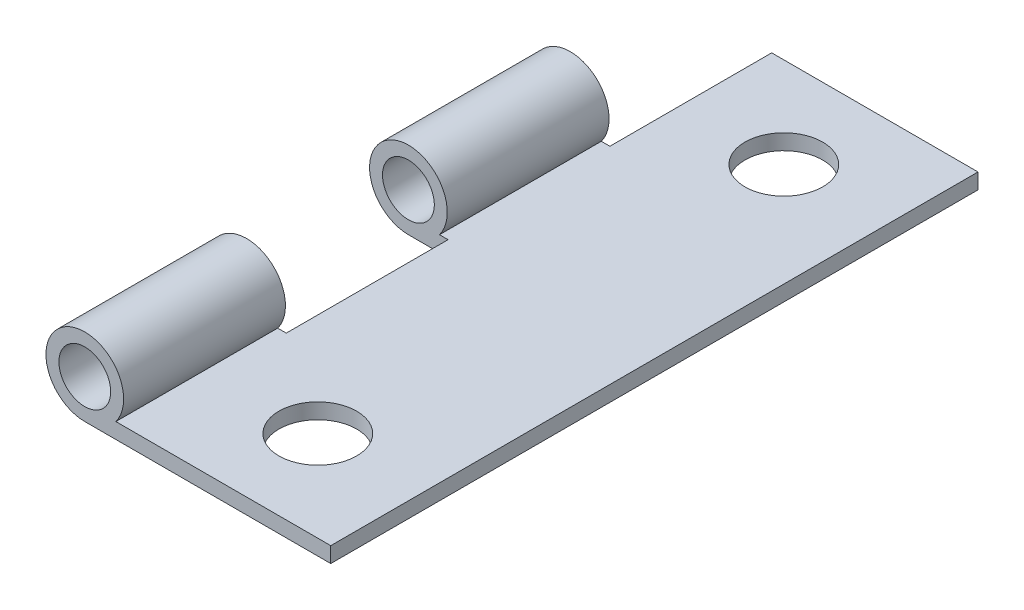
ISO-10303-21;
HEADER;
FILE_DESCRIPTION(('STEP AP214'),'2;1');
FILE_NAME('part.step','',(''),(''),'','','');
FILE_SCHEMA(('AUTOMOTIVE_DESIGN { 1 0 10303 214 1 1 1 1 }'));
ENDSEC;
DATA;
#1=APPLICATION_CONTEXT('core data for automotive mechanical design processes');
#2=APPLICATION_PROTOCOL_DEFINITION('international standard','automotive_design',2000,#1);
#3=PRODUCT_CONTEXT('',#1,'mechanical');
#4=PRODUCT('Part','Part','',(#3));
#5=PRODUCT_RELATED_PRODUCT_CATEGORY('part','',(#4));
#6=PRODUCT_DEFINITION_FORMATION('','',#4);
#7=PRODUCT_DEFINITION_CONTEXT('part definition',#1,'design');
#8=PRODUCT_DEFINITION('design','',#6,#7);
#9=PRODUCT_DEFINITION_SHAPE('','',#8);
#10=(LENGTH_UNIT() NAMED_UNIT(*) SI_UNIT(.MILLI.,.METRE.));
#11=(NAMED_UNIT(*) PLANE_ANGLE_UNIT() SI_UNIT($,.RADIAN.));
#12=(NAMED_UNIT(*) SI_UNIT($,.STERADIAN.) SOLID_ANGLE_UNIT());
#13=UNCERTAINTY_MEASURE_WITH_UNIT(LENGTH_MEASURE(1.E-05),#10,'distance_accuracy_value','');
#14=(GEOMETRIC_REPRESENTATION_CONTEXT(3) GLOBAL_UNCERTAINTY_ASSIGNED_CONTEXT((#13)) GLOBAL_UNIT_ASSIGNED_CONTEXT((#10,
#11,#12)) REPRESENTATION_CONTEXT('',''));
#15=CARTESIAN_POINT('',(0.,0.,0.));
#16=DIRECTION('',(0.,0.,1.));
#17=DIRECTION('',(1.,0.,0.));
#18=AXIS2_PLACEMENT_3D('',#15,#16,#17);
#19=CARTESIAN_POINT('',(0.,0.,12.5));
#20=DIRECTION('',(0.,0.,-1.));
#21=DIRECTION('',(-1.,0.,0.));
#22=AXIS2_PLACEMENT_3D('',#19,#20,#21);
#23=CYLINDRICAL_SURFACE('',#22,1.5);
#24=DIRECTION('',(0.,0.,-1.));
#25=VECTOR('',#24,1.);
#26=CARTESIAN_POINT('',(1.2,-0.900000000000001,12.5));
#27=LINE('',#26,#25);
#28=CARTESIAN_POINT('',(1.2,-0.900000000000001,0.));
#29=VERTEX_POINT('',#28);
#30=CARTESIAN_POINT('',(1.2,-0.900000000000001,-6.25));
#31=VERTEX_POINT('',#30);
#32=EDGE_CURVE('E170',#29,#31,#27,.T.);
#33=ORIENTED_EDGE('',*,*,#32,.T.);
#34=CARTESIAN_POINT('',(0.,0.,-6.25));
#35=DIRECTION('',(0.,0.,1.));
#36=DIRECTION('',(1.,0.,0.));
#37=AXIS2_PLACEMENT_3D('',#34,#35,#36);
#38=CIRCLE('',#37,1.5);
#39=CARTESIAN_POINT('',(0.,-1.5,-6.25));
#40=VERTEX_POINT('',#39);
#41=EDGE_CURVE('E48',#31,#40,#38,.T.);
#42=ORIENTED_EDGE('',*,*,#41,.T.);
#43=DIRECTION('',(0.,0.,-1.));
#44=VECTOR('',#43,1.);
#45=CARTESIAN_POINT('',(0.,-1.5,12.5));
#46=LINE('',#45,#44);
#47=CARTESIAN_POINT('',(0.,-1.5,0.));
#48=VERTEX_POINT('',#47);
#49=EDGE_CURVE('E185',#48,#40,#46,.T.);
#50=ORIENTED_EDGE('',*,*,#49,.F.);
#51=CARTESIAN_POINT('',(0.,0.,0.));
#52=DIRECTION('',(0.,0.,-1.));
#53=DIRECTION('',(-1.,0.,0.));
#54=AXIS2_PLACEMENT_3D('',#51,#52,#53);
#55=CIRCLE('',#54,1.5);
#56=EDGE_CURVE('E144',#48,#29,#55,.T.);
#57=ORIENTED_EDGE('',*,*,#56,.T.);
#58=EDGE_LOOP('',(#33,#42,#50,#57));
#59=FACE_BOUND('',#58,.T.);
#60=ADVANCED_FACE('F33',(#59),#23,.T.);
#61=CARTESIAN_POINT('',(0.,0.,12.5));
#62=DIRECTION('',(0.,0.,1.));
#63=DIRECTION('',(1.,0.,0.));
#64=AXIS2_PLACEMENT_3D('',#61,#62,#63);
#65=PLANE('',#64);
#66=CARTESIAN_POINT('',(0.,0.,12.5));
#67=DIRECTION('',(0.,0.,1.));
#68=DIRECTION('',(1.,0.,0.));
#69=AXIS2_PLACEMENT_3D('',#66,#67,#68);
#70=CIRCLE('',#69,1.5);
#71=CARTESIAN_POINT('',(1.2,-0.900000000000001,12.5));
#72=VERTEX_POINT('',#71);
#73=CARTESIAN_POINT('',(0.,-1.5,12.5));
#74=VERTEX_POINT('',#73);
#75=EDGE_CURVE('E160',#72,#74,#70,.T.);
#76=ORIENTED_EDGE('',*,*,#75,.T.);
#77=DIRECTION('',(1.,0.,0.));
#78=VECTOR('',#77,1.);
#79=CARTESIAN_POINT('',(0.,-1.5,12.5));
#80=LINE('',#79,#78);
#81=CARTESIAN_POINT('',(9.5,-1.5,12.5));
#82=VERTEX_POINT('',#81);
#83=EDGE_CURVE('E163',#74,#82,#80,.T.);
#84=ORIENTED_EDGE('',*,*,#83,.T.);
#85=DIRECTION('',(0.,1.,0.));
#86=VECTOR('',#85,1.);
#87=CARTESIAN_POINT('',(9.5,-1.5,12.5));
#88=LINE('',#87,#86);
#89=CARTESIAN_POINT('',(9.5,-0.9,12.5));
#90=VERTEX_POINT('',#89);
#91=EDGE_CURVE('E166',#82,#90,#88,.T.);
#92=ORIENTED_EDGE('',*,*,#91,.T.);
#93=DIRECTION('',(-1.,0.,0.));
#94=VECTOR('',#93,1.);
#95=CARTESIAN_POINT('',(9.5,-0.9,12.5));
#96=LINE('',#95,#94);
#97=EDGE_CURVE('E168',#90,#72,#96,.T.);
#98=ORIENTED_EDGE('',*,*,#97,.T.);
#99=EDGE_LOOP('',(#76,#84,#92,#98));
#100=FACE_BOUND('',#99,.T.);
#101=CARTESIAN_POINT('',(0.,0.,12.5));
#102=DIRECTION('',(0.,0.,1.));
#103=DIRECTION('',(1.,0.,0.));
#104=AXIS2_PLACEMENT_3D('',#101,#102,#103);
#105=CIRCLE('',#104,1.);
#106=CARTESIAN_POINT('',(1.,0.,12.5));
#107=VERTEX_POINT('',#106);
#108=EDGE_CURVE('E156',#107,#107,#105,.T.);
#109=ORIENTED_EDGE('',*,*,#108,.F.);
#110=EDGE_LOOP('',(#109));
#111=FACE_BOUND('',#110,.T.);
#112=ADVANCED_FACE('F246',(#100,#111),#65,.T.);
#113=CARTESIAN_POINT('',(0.,0.,-12.5));
#114=DIRECTION('',(0.,0.,1.));
#115=DIRECTION('',(1.,0.,0.));
#116=AXIS2_PLACEMENT_3D('',#113,#114,#115);
#117=PLANE('',#116);
#118=DIRECTION('',(1.,0.,0.));
#119=VECTOR('',#118,1.);
#120=CARTESIAN_POINT('',(0.,-1.5,-12.5));
#121=LINE('',#120,#119);
#122=CARTESIAN_POINT('',(1.53150582875412,-1.5,-12.5));
#123=VERTEX_POINT('',#122);
#124=CARTESIAN_POINT('',(9.5,-1.5,-12.5));
#125=VERTEX_POINT('',#124);
#126=EDGE_CURVE('E159',#123,#125,#121,.T.);
#127=ORIENTED_EDGE('',*,*,#126,.F.);
#128=DIRECTION('',(0.,1.,0.));
#129=VECTOR('',#128,1.);
#130=CARTESIAN_POINT('',(1.53150582875413,-13.4,-12.5));
#131=LINE('',#130,#129);
#132=CARTESIAN_POINT('',(1.53150582875412,-0.900000000000001,-12.5));
#133=VERTEX_POINT('',#132);
#134=EDGE_CURVE('E189',#123,#133,#131,.T.);
#135=ORIENTED_EDGE('',*,*,#134,.T.);
#136=DIRECTION('',(-1.,0.,0.));
#137=VECTOR('',#136,1.);
#138=CARTESIAN_POINT('',(9.5,-0.9,-12.5));
#139=LINE('',#138,#137);
#140=CARTESIAN_POINT('',(9.5,-0.9,-12.5));
#141=VERTEX_POINT('',#140);
#142=EDGE_CURVE('E164',#141,#133,#139,.T.);
#143=ORIENTED_EDGE('',*,*,#142,.F.);
#144=DIRECTION('',(0.,1.,0.));
#145=VECTOR('',#144,1.);
#146=CARTESIAN_POINT('',(9.5,-1.5,-12.5));
#147=LINE('',#146,#145);
#148=EDGE_CURVE('E172',#125,#141,#147,.T.);
#149=ORIENTED_EDGE('',*,*,#148,.F.);
#150=EDGE_LOOP('',(#127,#135,#143,#149));
#151=FACE_BOUND('',#150,.T.);
#152=ADVANCED_FACE('F243',(#151),#117,.F.);
#153=CARTESIAN_POINT('',(1.2,-0.900000000000001,6.25));
#154=VERTEX_POINT('',#153);
#155=EDGE_CURVE('E176',#72,#154,#27,.T.);
#156=ORIENTED_EDGE('',*,*,#155,.T.);
#157=CARTESIAN_POINT('',(0.,0.,6.25));
#158=DIRECTION('',(0.,0.,1.));
#159=DIRECTION('',(1.,0.,0.));
#160=AXIS2_PLACEMENT_3D('',#157,#158,#159);
#161=CIRCLE('',#160,1.5);
#162=CARTESIAN_POINT('',(0.,-1.5,6.25));
#163=VERTEX_POINT('',#162);
#164=EDGE_CURVE('E56',#154,#163,#161,.T.);
#165=ORIENTED_EDGE('',*,*,#164,.T.);
#166=EDGE_CURVE('E133',#74,#163,#46,.T.);
#167=ORIENTED_EDGE('',*,*,#166,.F.);
#168=ORIENTED_EDGE('',*,*,#75,.F.);
#169=EDGE_LOOP('',(#156,#165,#167,#168));
#170=FACE_BOUND('',#169,.T.);
#171=ADVANCED_FACE('F35',(#170),#23,.T.);
#172=CARTESIAN_POINT('',(0.,-1.5,12.5));
#173=DIRECTION('',(0.,1.,0.));
#174=DIRECTION('',(0.,0.,1.));
#175=AXIS2_PLACEMENT_3D('',#172,#173,#174);
#176=PLANE('',#175);
#177=CARTESIAN_POINT('',(5.5,-1.5,-9.));
#178=DIRECTION('',(0.,1.,0.));
#179=DIRECTION('',(0.,0.,1.));
#180=AXIS2_PLACEMENT_3D('',#177,#178,#179);
#181=CIRCLE('',#180,1.5);
#182=CARTESIAN_POINT('',(5.5,-1.5,-7.5));
#183=VERTEX_POINT('',#182);
#184=EDGE_CURVE('E127',#183,#183,#181,.T.);
#185=ORIENTED_EDGE('',*,*,#184,.T.);
#186=EDGE_LOOP('',(#185));
#187=FACE_BOUND('',#186,.T.);
#188=CARTESIAN_POINT('',(5.5,-1.5,9.));
#189=DIRECTION('',(0.,1.,0.));
#190=DIRECTION('',(0.,0.,1.));
#191=AXIS2_PLACEMENT_3D('',#188,#189,#190);
#192=CIRCLE('',#191,1.5);
#193=CARTESIAN_POINT('',(5.5,-1.5,10.5));
#194=VERTEX_POINT('',#193);
#195=EDGE_CURVE('E207',#194,#194,#192,.T.);
#196=ORIENTED_EDGE('',*,*,#195,.T.);
#197=EDGE_LOOP('',(#196));
#198=FACE_BOUND('',#197,.T.);
#199=DIRECTION('',(1.,0.,0.));
#200=VECTOR('',#199,1.);
#201=CARTESIAN_POINT('',(0.,-1.5,-6.25));
#202=LINE('',#201,#200);
#203=CARTESIAN_POINT('',(1.53150582875413,-1.5,-6.25));
#204=VERTEX_POINT('',#203);
#205=EDGE_CURVE('E122',#40,#204,#202,.T.);
#206=ORIENTED_EDGE('',*,*,#205,.T.);
#207=DIRECTION('',(0.,0.,-1.));
#208=VECTOR('',#207,1.);
#209=CARTESIAN_POINT('',(1.53150582875413,-1.5,12.5));
#210=LINE('',#209,#208);
#211=EDGE_CURVE('E121',#204,#123,#210,.T.);
#212=ORIENTED_EDGE('',*,*,#211,.T.);
#213=ORIENTED_EDGE('',*,*,#126,.T.);
#214=DIRECTION('',(0.,0.,-1.));
#215=VECTOR('',#214,1.);
#216=CARTESIAN_POINT('',(9.5,-1.5,12.5));
#217=LINE('',#216,#215);
#218=EDGE_CURVE('E182',#82,#125,#217,.T.);
#219=ORIENTED_EDGE('',*,*,#218,.F.);
#220=ORIENTED_EDGE('',*,*,#83,.F.);
#221=ORIENTED_EDGE('',*,*,#166,.T.);
#222=DIRECTION('',(1.,0.,0.));
#223=VECTOR('',#222,1.);
#224=CARTESIAN_POINT('',(0.,-1.5,6.25));
#225=LINE('',#224,#223);
#226=CARTESIAN_POINT('',(1.53150582875413,-1.5,6.25));
#227=VERTEX_POINT('',#226);
#228=EDGE_CURVE('E125',#163,#227,#225,.T.);
#229=ORIENTED_EDGE('',*,*,#228,.T.);
#230=DIRECTION('',(0.,0.,-1.));
#231=VECTOR('',#230,1.);
#232=CARTESIAN_POINT('',(1.53150582875413,-1.5,12.5));
#233=LINE('',#232,#231);
#234=CARTESIAN_POINT('',(1.53150582875413,-1.5,0.));
#235=VERTEX_POINT('',#234);
#236=EDGE_CURVE('E111',#227,#235,#233,.T.);
#237=ORIENTED_EDGE('',*,*,#236,.T.);
#238=DIRECTION('',(-1.,0.,0.));
#239=VECTOR('',#238,1.);
#240=CARTESIAN_POINT('',(0.,-1.5,0.));
#241=LINE('',#240,#239);
#242=EDGE_CURVE('E147',#235,#48,#241,.T.);
#243=ORIENTED_EDGE('',*,*,#242,.T.);
#244=ORIENTED_EDGE('',*,*,#49,.T.);
#245=EDGE_LOOP('',(#206,#212,#213,#219,#220,#221,#229,#237,#243,#244));
#246=FACE_BOUND('',#245,.T.);
#247=ADVANCED_FACE('F131',(#187,#198,#246),#176,.F.);
#248=CARTESIAN_POINT('',(9.5,-1.5,12.5));
#249=DIRECTION('',(-1.,0.,0.));
#250=DIRECTION('',(0.,0.,1.));
#251=AXIS2_PLACEMENT_3D('',#248,#249,#250);
#252=PLANE('',#251);
#253=ORIENTED_EDGE('',*,*,#148,.T.);
#254=DIRECTION('',(0.,0.,-1.));
#255=VECTOR('',#254,1.);
#256=CARTESIAN_POINT('',(9.5,-0.9,12.5));
#257=LINE('',#256,#255);
#258=EDGE_CURVE('E179',#90,#141,#257,.T.);
#259=ORIENTED_EDGE('',*,*,#258,.F.);
#260=ORIENTED_EDGE('',*,*,#91,.F.);
#261=ORIENTED_EDGE('',*,*,#218,.T.);
#262=EDGE_LOOP('',(#253,#259,#260,#261));
#263=FACE_BOUND('',#262,.T.);
#264=ADVANCED_FACE('F223',(#263),#252,.F.);
#265=CARTESIAN_POINT('',(9.5,-0.9,12.5));
#266=DIRECTION('',(0.,-1.,0.));
#267=DIRECTION('',(1.,0.,0.));
#268=AXIS2_PLACEMENT_3D('',#265,#266,#267);
#269=PLANE('',#268);
#270=CARTESIAN_POINT('',(5.5,-0.900000000000001,-9.));
#271=DIRECTION('',(0.,1.,0.));
#272=DIRECTION('',(-1.,0.,0.));
#273=AXIS2_PLACEMENT_3D('',#270,#271,#272);
#274=CIRCLE('',#273,1.5);
#275=CARTESIAN_POINT('',(4.,-0.900000000000001,-9.));
#276=VERTEX_POINT('',#275);
#277=EDGE_CURVE('E210',#276,#276,#274,.T.);
#278=ORIENTED_EDGE('',*,*,#277,.F.);
#279=EDGE_LOOP('',(#278));
#280=FACE_BOUND('',#279,.T.);
#281=CARTESIAN_POINT('',(5.5,-0.900000000000001,9.));
#282=DIRECTION('',(0.,1.,0.));
#283=DIRECTION('',(-1.,0.,0.));
#284=AXIS2_PLACEMENT_3D('',#281,#282,#283);
#285=CIRCLE('',#284,1.5);
#286=CARTESIAN_POINT('',(4.,-0.900000000000001,9.));
#287=VERTEX_POINT('',#286);
#288=EDGE_CURVE('E211',#287,#287,#285,.T.);
#289=ORIENTED_EDGE('',*,*,#288,.F.);
#290=EDGE_LOOP('',(#289));
#291=FACE_BOUND('',#290,.T.);
#292=ORIENTED_EDGE('',*,*,#142,.T.);
#293=DIRECTION('',(0.,0.,1.));
#294=VECTOR('',#293,1.);
#295=CARTESIAN_POINT('',(1.53150582875413,-0.900000000000001,12.5));
#296=LINE('',#295,#294);
#297=CARTESIAN_POINT('',(1.53150582875413,-0.900000000000001,-6.25));
#298=VERTEX_POINT('',#297);
#299=EDGE_CURVE('E11',#133,#298,#296,.T.);
#300=ORIENTED_EDGE('',*,*,#299,.T.);
#301=DIRECTION('',(-1.,0.,0.));
#302=VECTOR('',#301,1.);
#303=CARTESIAN_POINT('',(9.5,-0.9,-6.25));
#304=LINE('',#303,#302);
#305=EDGE_CURVE('E150',#298,#31,#304,.T.);
#306=ORIENTED_EDGE('',*,*,#305,.T.);
#307=ORIENTED_EDGE('',*,*,#32,.F.);
#308=DIRECTION('',(1.,0.,0.));
#309=VECTOR('',#308,1.);
#310=CARTESIAN_POINT('',(9.5,-0.9,0.));
#311=LINE('',#310,#309);
#312=CARTESIAN_POINT('',(1.53150582875413,-0.900000000000001,0.));
#313=VERTEX_POINT('',#312);
#314=EDGE_CURVE('E137',#29,#313,#311,.T.);
#315=ORIENTED_EDGE('',*,*,#314,.T.);
#316=DIRECTION('',(0.,0.,1.));
#317=VECTOR('',#316,1.);
#318=CARTESIAN_POINT('',(1.53150582875413,-0.900000000000001,12.5));
#319=LINE('',#318,#317);
#320=CARTESIAN_POINT('',(1.53150582875413,-0.900000000000001,6.25));
#321=VERTEX_POINT('',#320);
#322=EDGE_CURVE('E41',#313,#321,#319,.T.);
#323=ORIENTED_EDGE('',*,*,#322,.T.);
#324=DIRECTION('',(-1.,0.,0.));
#325=VECTOR('',#324,1.);
#326=CARTESIAN_POINT('',(9.5,-0.9,6.25));
#327=LINE('',#326,#325);
#328=EDGE_CURVE('E126',#321,#154,#327,.T.);
#329=ORIENTED_EDGE('',*,*,#328,.T.);
#330=ORIENTED_EDGE('',*,*,#155,.F.);
#331=ORIENTED_EDGE('',*,*,#97,.F.);
#332=ORIENTED_EDGE('',*,*,#258,.T.);
#333=EDGE_LOOP('',(#292,#300,#306,#307,#315,#323,#329,#330,#331,#332));
#334=FACE_BOUND('',#333,.T.);
#335=ADVANCED_FACE('F193',(#280,#291,#334),#269,.F.);
#336=CARTESIAN_POINT('',(0.,0.,12.5));
#337=DIRECTION('',(0.,0.,-1.));
#338=DIRECTION('',(-1.,0.,0.));
#339=AXIS2_PLACEMENT_3D('',#336,#337,#338);
#340=CYLINDRICAL_SURFACE('',#339,1.);
#341=CARTESIAN_POINT('',(0.,0.,6.25));
#342=DIRECTION('',(0.,0.,1.));
#343=DIRECTION('',(1.,0.,0.));
#344=AXIS2_PLACEMENT_3D('',#341,#342,#343);
#345=CIRCLE('',#344,1.);
#346=CARTESIAN_POINT('',(1.,0.,6.25));
#347=VERTEX_POINT('',#346);
#348=EDGE_CURVE('E187',#347,#347,#345,.T.);
#349=ORIENTED_EDGE('',*,*,#348,.F.);
#350=EDGE_LOOP('',(#349));
#351=FACE_BOUND('',#350,.T.);
#352=ORIENTED_EDGE('',*,*,#108,.T.);
#353=EDGE_LOOP('',(#352));
#354=FACE_BOUND('',#353,.T.);
#355=ADVANCED_FACE('F222',(#351,#354),#340,.F.);
#356=CARTESIAN_POINT('',(1.53150582875413,-13.4,0.));
#357=DIRECTION('',(1.,0.,0.));
#358=DIRECTION('',(0.,0.,-1.));
#359=AXIS2_PLACEMENT_3D('',#356,#357,#358);
#360=PLANE('',#359);
#361=DIRECTION('',(0.,1.,0.));
#362=VECTOR('',#361,1.);
#363=CARTESIAN_POINT('',(1.53150582875413,-13.4,6.25));
#364=LINE('',#363,#362);
#365=EDGE_CURVE('E114',#227,#321,#364,.T.);
#366=ORIENTED_EDGE('',*,*,#365,.T.);
#367=ORIENTED_EDGE('',*,*,#322,.F.);
#368=DIRECTION('',(0.,1.,0.));
#369=VECTOR('',#368,1.);
#370=CARTESIAN_POINT('',(1.53150582875413,-13.4,0.));
#371=LINE('',#370,#369);
#372=EDGE_CURVE('E117',#235,#313,#371,.T.);
#373=ORIENTED_EDGE('',*,*,#372,.F.);
#374=ORIENTED_EDGE('',*,*,#236,.F.);
#375=EDGE_LOOP('',(#366,#367,#373,#374));
#376=FACE_BOUND('',#375,.T.);
#377=ADVANCED_FACE('F113',(#376),#360,.F.);
#378=CARTESIAN_POINT('',(-2.4652847148341,-13.4,0.));
#379=DIRECTION('',(0.,0.,-1.));
#380=DIRECTION('',(-1.,0.,0.));
#381=AXIS2_PLACEMENT_3D('',#378,#379,#380);
#382=PLANE('',#381);
#383=CARTESIAN_POINT('',(0.,0.,0.));
#384=DIRECTION('',(0.,0.,-1.));
#385=DIRECTION('',(-1.,0.,0.));
#386=AXIS2_PLACEMENT_3D('',#383,#384,#385);
#387=CIRCLE('',#386,1.);
#388=CARTESIAN_POINT('',(-1.,0.,0.));
#389=VERTEX_POINT('',#388);
#390=EDGE_CURVE('E134',#389,#389,#387,.T.);
#391=ORIENTED_EDGE('',*,*,#390,.T.);
#392=EDGE_LOOP('',(#391));
#393=FACE_BOUND('',#392,.T.);
#394=ORIENTED_EDGE('',*,*,#372,.T.);
#395=ORIENTED_EDGE('',*,*,#314,.F.);
#396=ORIENTED_EDGE('',*,*,#56,.F.);
#397=ORIENTED_EDGE('',*,*,#242,.F.);
#398=EDGE_LOOP('',(#394,#395,#396,#397));
#399=FACE_BOUND('',#398,.T.);
#400=ADVANCED_FACE('F197',(#393,#399),#382,.F.);
#401=CARTESIAN_POINT('',(-2.4652847148341,-13.4,6.25));
#402=DIRECTION('',(0.,0.,1.));
#403=DIRECTION('',(1.,0.,0.));
#404=AXIS2_PLACEMENT_3D('',#401,#402,#403);
#405=PLANE('',#404);
#406=ORIENTED_EDGE('',*,*,#348,.T.);
#407=EDGE_LOOP('',(#406));
#408=FACE_BOUND('',#407,.T.);
#409=ORIENTED_EDGE('',*,*,#164,.F.);
#410=ORIENTED_EDGE('',*,*,#328,.F.);
#411=ORIENTED_EDGE('',*,*,#365,.F.);
#412=ORIENTED_EDGE('',*,*,#228,.F.);
#413=EDGE_LOOP('',(#409,#410,#411,#412));
#414=FACE_BOUND('',#413,.T.);
#415=ADVANCED_FACE('F124',(#408,#414),#405,.F.);
#416=CARTESIAN_POINT('',(0.,0.,-6.25));
#417=DIRECTION('',(0.,0.,1.));
#418=DIRECTION('',(1.,0.,0.));
#419=AXIS2_PLACEMENT_3D('',#416,#417,#418);
#420=CIRCLE('',#419,1.);
#421=CARTESIAN_POINT('',(1.,0.,-6.25));
#422=VERTEX_POINT('',#421);
#423=EDGE_CURVE('E149',#422,#422,#420,.T.);
#424=ORIENTED_EDGE('',*,*,#423,.F.);
#425=EDGE_LOOP('',(#424));
#426=FACE_BOUND('',#425,.T.);
#427=ORIENTED_EDGE('',*,*,#390,.F.);
#428=EDGE_LOOP('',(#427));
#429=FACE_BOUND('',#428,.T.);
#430=ADVANCED_FACE('F274',(#426,#429),#340,.F.);
#431=CARTESIAN_POINT('',(1.53150582875413,-13.4,-12.5));
#432=DIRECTION('',(1.,0.,0.));
#433=DIRECTION('',(0.,1.,0.));
#434=AXIS2_PLACEMENT_3D('',#431,#432,#433);
#435=PLANE('',#434);
#436=DIRECTION('',(0.,1.,0.));
#437=VECTOR('',#436,1.);
#438=CARTESIAN_POINT('',(1.53150582875413,-13.4,-6.25));
#439=LINE('',#438,#437);
#440=EDGE_CURVE('E198',#204,#298,#439,.T.);
#441=ORIENTED_EDGE('',*,*,#440,.T.);
#442=ORIENTED_EDGE('',*,*,#299,.F.);
#443=ORIENTED_EDGE('',*,*,#134,.F.);
#444=ORIENTED_EDGE('',*,*,#211,.F.);
#445=EDGE_LOOP('',(#441,#442,#443,#444));
#446=FACE_BOUND('',#445,.T.);
#447=ADVANCED_FACE('F258',(#446),#435,.F.);
#448=CARTESIAN_POINT('',(-2.00845857184769,-13.4,-6.25));
#449=DIRECTION('',(0.,0.,1.));
#450=DIRECTION('',(1.,0.,0.));
#451=AXIS2_PLACEMENT_3D('',#448,#449,#450);
#452=PLANE('',#451);
#453=ORIENTED_EDGE('',*,*,#423,.T.);
#454=EDGE_LOOP('',(#453));
#455=FACE_BOUND('',#454,.T.);
#456=ORIENTED_EDGE('',*,*,#41,.F.);
#457=ORIENTED_EDGE('',*,*,#305,.F.);
#458=ORIENTED_EDGE('',*,*,#440,.F.);
#459=ORIENTED_EDGE('',*,*,#205,.F.);
#460=EDGE_LOOP('',(#456,#457,#458,#459));
#461=FACE_BOUND('',#460,.T.);
#462=ADVANCED_FACE('F230',(#455,#461),#452,.F.);
#463=CARTESIAN_POINT('',(5.5,-10.9,9.));
#464=DIRECTION('',(0.,1.,0.));
#465=DIRECTION('',(-1.,0.,0.));
#466=AXIS2_PLACEMENT_3D('',#463,#464,#465);
#467=CYLINDRICAL_SURFACE('',#466,1.5);
#468=ORIENTED_EDGE('',*,*,#288,.T.);
#469=EDGE_LOOP('',(#468));
#470=FACE_BOUND('',#469,.T.);
#471=ORIENTED_EDGE('',*,*,#195,.F.);
#472=EDGE_LOOP('',(#471));
#473=FACE_BOUND('',#472,.T.);
#474=ADVANCED_FACE('F227',(#470,#473),#467,.F.);
#475=CARTESIAN_POINT('',(5.5,-10.9,-9.));
#476=DIRECTION('',(0.,1.,0.));
#477=DIRECTION('',(-1.,0.,0.));
#478=AXIS2_PLACEMENT_3D('',#475,#476,#477);
#479=CYLINDRICAL_SURFACE('',#478,1.5);
#480=ORIENTED_EDGE('',*,*,#277,.T.);
#481=EDGE_LOOP('',(#480));
#482=FACE_BOUND('',#481,.T.);
#483=ORIENTED_EDGE('',*,*,#184,.F.);
#484=EDGE_LOOP('',(#483));
#485=FACE_BOUND('',#484,.T.);
#486=ADVANCED_FACE('F217',(#482,#485),#479,.F.);
#487=CLOSED_SHELL('',(#60,#112,#152,#171,#247,#264,#335,#355,#377,#400,#415,#430,#447,#462,#474,#486));
#488=MANIFOLD_SOLID_BREP('B2',#487);
#489=ADVANCED_BREP_SHAPE_REPRESENTATION('',(#18,#488),#14);
#490=SHAPE_DEFINITION_REPRESENTATION(#9,#489);
ENDSEC;
END-ISO-10303-21;
